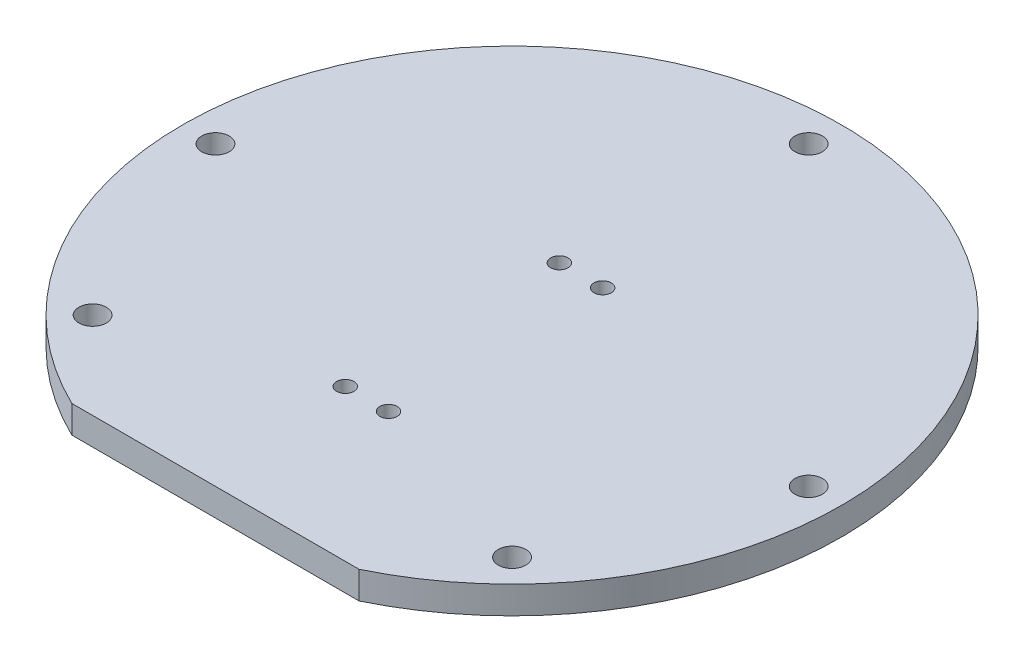
ISO-10303-21;
HEADER;
FILE_DESCRIPTION(('STEP AP214'),'2;1');
FILE_NAME('part.step','',(''),(''),'','','');
FILE_SCHEMA(('AUTOMOTIVE_DESIGN { 1 0 10303 214 1 1 1 1 }'));
ENDSEC;
DATA;
#1=APPLICATION_CONTEXT('core data for automotive mechanical design processes');
#2=APPLICATION_PROTOCOL_DEFINITION('international standard','automotive_design',2000,#1);
#3=PRODUCT_CONTEXT('',#1,'mechanical');
#4=PRODUCT('Part','Part','',(#3));
#5=PRODUCT_RELATED_PRODUCT_CATEGORY('part','',(#4));
#6=PRODUCT_DEFINITION_FORMATION('','',#4);
#7=PRODUCT_DEFINITION_CONTEXT('part definition',#1,'design');
#8=PRODUCT_DEFINITION('design','',#6,#7);
#9=PRODUCT_DEFINITION_SHAPE('','',#8);
#10=(LENGTH_UNIT() NAMED_UNIT(*) SI_UNIT(.MILLI.,.METRE.));
#11=(NAMED_UNIT(*) PLANE_ANGLE_UNIT() SI_UNIT($,.RADIAN.));
#12=(NAMED_UNIT(*) SI_UNIT($,.STERADIAN.) SOLID_ANGLE_UNIT());
#13=UNCERTAINTY_MEASURE_WITH_UNIT(LENGTH_MEASURE(1.E-05),#10,'distance_accuracy_value','');
#14=(GEOMETRIC_REPRESENTATION_CONTEXT(3) GLOBAL_UNCERTAINTY_ASSIGNED_CONTEXT((#13)) GLOBAL_UNIT_ASSIGNED_CONTEXT((#10,
#11,#12)) REPRESENTATION_CONTEXT('',''));
#15=CARTESIAN_POINT('',(0.,0.,0.));
#16=DIRECTION('',(0.,0.,1.));
#17=DIRECTION('',(1.,0.,0.));
#18=AXIS2_PLACEMENT_3D('',#15,#16,#17);
#19=CARTESIAN_POINT('',(0.,6.35,68.58));
#20=DIRECTION('',(0.,0.,1.));
#21=DIRECTION('',(1.,0.,0.));
#22=AXIS2_PLACEMENT_3D('',#19,#20,#21);
#23=PLANE('',#22);
#24=DIRECTION('',(-1.,0.,0.));
#25=VECTOR('',#24,1.);
#26=CARTESIAN_POINT('',(0.,0.,68.58));
#27=LINE('',#26,#25);
#28=CARTESIAN_POINT('',(33.2148099497799,0.,68.58));
#29=VERTEX_POINT('',#28);
#30=CARTESIAN_POINT('',(-33.2148099497799,0.,68.58));
#31=VERTEX_POINT('',#30);
#32=EDGE_CURVE('E77',#29,#31,#27,.T.);
#33=ORIENTED_EDGE('',*,*,#32,.F.);
#34=DIRECTION('',(0.,-1.,0.));
#35=VECTOR('',#34,1.);
#36=CARTESIAN_POINT('',(33.2148099497799,6.35,68.58));
#37=LINE('',#36,#35);
#38=CARTESIAN_POINT('',(33.2148099497799,6.35,68.58));
#39=VERTEX_POINT('',#38);
#40=EDGE_CURVE('E13',#39,#29,#37,.T.);
#41=ORIENTED_EDGE('',*,*,#40,.F.);
#42=DIRECTION('',(-1.,0.,0.));
#43=VECTOR('',#42,1.);
#44=CARTESIAN_POINT('',(0.,6.35,68.58));
#45=LINE('',#44,#43);
#46=CARTESIAN_POINT('',(-33.2148099497799,6.35,68.58));
#47=VERTEX_POINT('',#46);
#48=EDGE_CURVE('E78',#39,#47,#45,.T.);
#49=ORIENTED_EDGE('',*,*,#48,.T.);
#50=DIRECTION('',(0.,-1.,0.));
#51=VECTOR('',#50,1.);
#52=CARTESIAN_POINT('',(-33.2148099497799,6.35,68.58));
#53=LINE('',#52,#51);
#54=EDGE_CURVE('E57',#47,#31,#53,.T.);
#55=ORIENTED_EDGE('',*,*,#54,.T.);
#56=EDGE_LOOP('',(#33,#41,#49,#55));
#57=FACE_BOUND('',#56,.T.);
#58=ADVANCED_FACE('F48',(#57),#23,.T.);
#59=CARTESIAN_POINT('',(-5.0038,6.35,-15.9411453369293));
#60=DIRECTION('',(0.,-1.,0.));
#61=DIRECTION('',(0.,0.,-1.));
#62=AXIS2_PLACEMENT_3D('',#59,#60,#61);
#63=CYLINDRICAL_SURFACE('',#62,2.);
#64=CARTESIAN_POINT('',(-5.0038,6.35,-15.9411453369293));
#65=DIRECTION('',(0.,1.,0.));
#66=DIRECTION('',(0.,0.,1.));
#67=AXIS2_PLACEMENT_3D('',#64,#65,#66);
#68=CIRCLE('',#67,2.);
#69=CARTESIAN_POINT('',(-5.0038,6.35,-13.9411453369293));
#70=VERTEX_POINT('',#69);
#71=EDGE_CURVE('E116',#70,#70,#68,.T.);
#72=ORIENTED_EDGE('',*,*,#71,.T.);
#73=EDGE_LOOP('',(#72));
#74=FACE_BOUND('',#73,.T.);
#75=CARTESIAN_POINT('',(-5.0038,0.,-15.9411453369293));
#76=DIRECTION('',(0.,1.,0.));
#77=DIRECTION('',(0.,0.,1.));
#78=AXIS2_PLACEMENT_3D('',#75,#76,#77);
#79=CIRCLE('',#78,2.);
#80=CARTESIAN_POINT('',(-5.0038,0.,-13.9411453369293));
#81=VERTEX_POINT('',#80);
#82=EDGE_CURVE('E85',#81,#81,#79,.T.);
#83=ORIENTED_EDGE('',*,*,#82,.F.);
#84=EDGE_LOOP('',(#83));
#85=FACE_BOUND('',#84,.T.);
#86=ADVANCED_FACE('F165',(#74,#85),#63,.F.);
#87=CARTESIAN_POINT('',(5.0038,6.35,33.5634546630707));
#88=DIRECTION('',(0.,-1.,0.));
#89=DIRECTION('',(0.,0.,-1.));
#90=AXIS2_PLACEMENT_3D('',#87,#88,#89);
#91=CYLINDRICAL_SURFACE('',#90,2.);
#92=CARTESIAN_POINT('',(5.0038,6.35,33.5634546630707));
#93=DIRECTION('',(0.,1.,0.));
#94=DIRECTION('',(0.,0.,1.));
#95=AXIS2_PLACEMENT_3D('',#92,#93,#94);
#96=CIRCLE('',#95,2.);
#97=CARTESIAN_POINT('',(5.0038,6.35,35.5634546630707));
#98=VERTEX_POINT('',#97);
#99=EDGE_CURVE('E119',#98,#98,#96,.T.);
#100=ORIENTED_EDGE('',*,*,#99,.T.);
#101=EDGE_LOOP('',(#100));
#102=FACE_BOUND('',#101,.T.);
#103=CARTESIAN_POINT('',(5.0038,0.,33.5634546630707));
#104=DIRECTION('',(0.,1.,0.));
#105=DIRECTION('',(0.,0.,1.));
#106=AXIS2_PLACEMENT_3D('',#103,#104,#105);
#107=CIRCLE('',#106,2.);
#108=CARTESIAN_POINT('',(5.0038,0.,35.5634546630707));
#109=VERTEX_POINT('',#108);
#110=EDGE_CURVE('E88',#109,#109,#107,.T.);
#111=ORIENTED_EDGE('',*,*,#110,.F.);
#112=EDGE_LOOP('',(#111));
#113=FACE_BOUND('',#112,.T.);
#114=ADVANCED_FACE('F168',(#102,#113),#91,.F.);
#115=CARTESIAN_POINT('',(5.0038,6.35,-15.9411453369293));
#116=DIRECTION('',(0.,-1.,0.));
#117=DIRECTION('',(0.,0.,-1.));
#118=AXIS2_PLACEMENT_3D('',#115,#116,#117);
#119=CYLINDRICAL_SURFACE('',#118,2.);
#120=CARTESIAN_POINT('',(5.0038,6.35,-15.9411453369293));
#121=DIRECTION('',(0.,1.,0.));
#122=DIRECTION('',(0.,0.,1.));
#123=AXIS2_PLACEMENT_3D('',#120,#121,#122);
#124=CIRCLE('',#123,2.);
#125=CARTESIAN_POINT('',(5.0038,6.35,-13.9411453369293));
#126=VERTEX_POINT('',#125);
#127=EDGE_CURVE('E122',#126,#126,#124,.T.);
#128=ORIENTED_EDGE('',*,*,#127,.T.);
#129=EDGE_LOOP('',(#128));
#130=FACE_BOUND('',#129,.T.);
#131=CARTESIAN_POINT('',(5.0038,0.,-15.9411453369293));
#132=DIRECTION('',(0.,1.,0.));
#133=DIRECTION('',(0.,0.,1.));
#134=AXIS2_PLACEMENT_3D('',#131,#132,#133);
#135=CIRCLE('',#134,2.);
#136=CARTESIAN_POINT('',(5.0038,0.,-13.9411453369293));
#137=VERTEX_POINT('',#136);
#138=EDGE_CURVE('E93',#137,#137,#135,.T.);
#139=ORIENTED_EDGE('',*,*,#138,.F.);
#140=EDGE_LOOP('',(#139));
#141=FACE_BOUND('',#140,.T.);
#142=ADVANCED_FACE('F186',(#130,#141),#119,.F.);
#143=CARTESIAN_POINT('',(-5.0038,6.35,33.5634546630707));
#144=DIRECTION('',(0.,-1.,0.));
#145=DIRECTION('',(0.,0.,-1.));
#146=AXIS2_PLACEMENT_3D('',#143,#144,#145);
#147=CYLINDRICAL_SURFACE('',#146,2.);
#148=CARTESIAN_POINT('',(-5.0038,6.35,33.5634546630707));
#149=DIRECTION('',(0.,1.,0.));
#150=DIRECTION('',(0.,0.,1.));
#151=AXIS2_PLACEMENT_3D('',#148,#149,#150);
#152=CIRCLE('',#151,2.);
#153=CARTESIAN_POINT('',(-5.0038,6.35,35.5634546630707));
#154=VERTEX_POINT('',#153);
#155=EDGE_CURVE('E125',#154,#154,#152,.T.);
#156=ORIENTED_EDGE('',*,*,#155,.T.);
#157=EDGE_LOOP('',(#156));
#158=FACE_BOUND('',#157,.T.);
#159=CARTESIAN_POINT('',(-5.0038,0.,33.5634546630707));
#160=DIRECTION('',(0.,1.,0.));
#161=DIRECTION('',(0.,0.,1.));
#162=AXIS2_PLACEMENT_3D('',#159,#160,#161);
#163=CIRCLE('',#162,2.);
#164=CARTESIAN_POINT('',(-5.0038,0.,35.5634546630707));
#165=VERTEX_POINT('',#164);
#166=EDGE_CURVE('E96',#165,#165,#163,.T.);
#167=ORIENTED_EDGE('',*,*,#166,.F.);
#168=EDGE_LOOP('',(#167));
#169=FACE_BOUND('',#168,.T.);
#170=ADVANCED_FACE('F190',(#158,#169),#147,.F.);
#171=CARTESIAN_POINT('',(-68.58,6.35,0.));
#172=DIRECTION('',(0.,-1.,0.));
#173=DIRECTION('',(0.,0.,-1.));
#174=AXIS2_PLACEMENT_3D('',#171,#172,#173);
#175=CYLINDRICAL_SURFACE('',#174,3.175);
#176=CARTESIAN_POINT('',(-68.58,6.35,0.));
#177=DIRECTION('',(0.,1.,0.));
#178=DIRECTION('',(0.,0.,1.));
#179=AXIS2_PLACEMENT_3D('',#176,#177,#178);
#180=CIRCLE('',#179,3.175);
#181=CARTESIAN_POINT('',(-68.58,6.35,3.175));
#182=VERTEX_POINT('',#181);
#183=EDGE_CURVE('E128',#182,#182,#180,.T.);
#184=ORIENTED_EDGE('',*,*,#183,.T.);
#185=EDGE_LOOP('',(#184));
#186=FACE_BOUND('',#185,.T.);
#187=CARTESIAN_POINT('',(-68.58,0.,0.));
#188=DIRECTION('',(0.,1.,0.));
#189=DIRECTION('',(0.,0.,1.));
#190=AXIS2_PLACEMENT_3D('',#187,#188,#189);
#191=CIRCLE('',#190,3.175);
#192=CARTESIAN_POINT('',(-68.58,0.,3.175));
#193=VERTEX_POINT('',#192);
#194=EDGE_CURVE('E99',#193,#193,#191,.T.);
#195=ORIENTED_EDGE('',*,*,#194,.F.);
#196=EDGE_LOOP('',(#195));
#197=FACE_BOUND('',#196,.T.);
#198=ADVANCED_FACE('F194',(#186,#197),#175,.F.);
#199=CARTESIAN_POINT('',(68.58,6.35,0.));
#200=DIRECTION('',(0.,-1.,0.));
#201=DIRECTION('',(0.,0.,-1.));
#202=AXIS2_PLACEMENT_3D('',#199,#200,#201);
#203=CYLINDRICAL_SURFACE('',#202,3.175);
#204=CARTESIAN_POINT('',(68.58,6.35,0.));
#205=DIRECTION('',(0.,1.,0.));
#206=DIRECTION('',(0.,0.,1.));
#207=AXIS2_PLACEMENT_3D('',#204,#205,#206);
#208=CIRCLE('',#207,3.175);
#209=CARTESIAN_POINT('',(68.58,6.35,3.175));
#210=VERTEX_POINT('',#209);
#211=EDGE_CURVE('E131',#210,#210,#208,.T.);
#212=ORIENTED_EDGE('',*,*,#211,.T.);
#213=EDGE_LOOP('',(#212));
#214=FACE_BOUND('',#213,.T.);
#215=CARTESIAN_POINT('',(68.58,0.,0.));
#216=DIRECTION('',(0.,1.,0.));
#217=DIRECTION('',(0.,0.,1.));
#218=AXIS2_PLACEMENT_3D('',#215,#216,#217);
#219=CIRCLE('',#218,3.175);
#220=CARTESIAN_POINT('',(68.58,0.,3.175));
#221=VERTEX_POINT('',#220);
#222=EDGE_CURVE('E102',#221,#221,#219,.T.);
#223=ORIENTED_EDGE('',*,*,#222,.F.);
#224=EDGE_LOOP('',(#223));
#225=FACE_BOUND('',#224,.T.);
#226=ADVANCED_FACE('F198',(#214,#225),#203,.F.);
#227=CARTESIAN_POINT('',(0.,6.35,-68.58));
#228=DIRECTION('',(0.,-1.,0.));
#229=DIRECTION('',(0.,0.,-1.));
#230=AXIS2_PLACEMENT_3D('',#227,#228,#229);
#231=CYLINDRICAL_SURFACE('',#230,3.175);
#232=CARTESIAN_POINT('',(0.,6.35,-68.58));
#233=DIRECTION('',(0.,1.,0.));
#234=DIRECTION('',(0.,0.,1.));
#235=AXIS2_PLACEMENT_3D('',#232,#233,#234);
#236=CIRCLE('',#235,3.175);
#237=CARTESIAN_POINT('',(0.,6.35,-65.405));
#238=VERTEX_POINT('',#237);
#239=EDGE_CURVE('E134',#238,#238,#236,.T.);
#240=ORIENTED_EDGE('',*,*,#239,.T.);
#241=EDGE_LOOP('',(#240));
#242=FACE_BOUND('',#241,.T.);
#243=CARTESIAN_POINT('',(0.,0.,-68.58));
#244=DIRECTION('',(0.,1.,0.));
#245=DIRECTION('',(0.,0.,1.));
#246=AXIS2_PLACEMENT_3D('',#243,#244,#245);
#247=CIRCLE('',#246,3.175);
#248=CARTESIAN_POINT('',(0.,0.,-65.405));
#249=VERTEX_POINT('',#248);
#250=EDGE_CURVE('E105',#249,#249,#247,.T.);
#251=ORIENTED_EDGE('',*,*,#250,.F.);
#252=EDGE_LOOP('',(#251));
#253=FACE_BOUND('',#252,.T.);
#254=ADVANCED_FACE('F202',(#242,#253),#231,.F.);
#255=CARTESIAN_POINT('',(-48.4933830537733,6.35,48.4933830537735));
#256=DIRECTION('',(0.,-1.,0.));
#257=DIRECTION('',(0.,0.,-1.));
#258=AXIS2_PLACEMENT_3D('',#255,#256,#257);
#259=CYLINDRICAL_SURFACE('',#258,3.175);
#260=CARTESIAN_POINT('',(-48.4933830537733,6.35,48.4933830537735));
#261=DIRECTION('',(0.,1.,0.));
#262=DIRECTION('',(0.,0.,1.));
#263=AXIS2_PLACEMENT_3D('',#260,#261,#262);
#264=CIRCLE('',#263,3.175);
#265=CARTESIAN_POINT('',(-48.4933830537733,6.35,51.6683830537735));
#266=VERTEX_POINT('',#265);
#267=EDGE_CURVE('E137',#266,#266,#264,.T.);
#268=ORIENTED_EDGE('',*,*,#267,.T.);
#269=EDGE_LOOP('',(#268));
#270=FACE_BOUND('',#269,.T.);
#271=CARTESIAN_POINT('',(-48.4933830537733,0.,48.4933830537735));
#272=DIRECTION('',(0.,1.,0.));
#273=DIRECTION('',(0.,0.,1.));
#274=AXIS2_PLACEMENT_3D('',#271,#272,#273);
#275=CIRCLE('',#274,3.175);
#276=CARTESIAN_POINT('',(-48.4933830537733,0.,51.6683830537735));
#277=VERTEX_POINT('',#276);
#278=EDGE_CURVE('E108',#277,#277,#275,.T.);
#279=ORIENTED_EDGE('',*,*,#278,.F.);
#280=EDGE_LOOP('',(#279));
#281=FACE_BOUND('',#280,.T.);
#282=ADVANCED_FACE('F205',(#270,#281),#259,.F.);
#283=CARTESIAN_POINT('',(48.4933830537733,6.35,48.4933830537735));
#284=DIRECTION('',(0.,-1.,0.));
#285=DIRECTION('',(0.,0.,-1.));
#286=AXIS2_PLACEMENT_3D('',#283,#284,#285);
#287=CYLINDRICAL_SURFACE('',#286,3.175);
#288=CARTESIAN_POINT('',(48.4933830537733,6.35,48.4933830537735));
#289=DIRECTION('',(0.,1.,0.));
#290=DIRECTION('',(0.,0.,1.));
#291=AXIS2_PLACEMENT_3D('',#288,#289,#290);
#292=CIRCLE('',#291,3.175);
#293=CARTESIAN_POINT('',(48.4933830537733,6.35,51.6683830537735));
#294=VERTEX_POINT('',#293);
#295=EDGE_CURVE('E82',#294,#294,#292,.T.);
#296=ORIENTED_EDGE('',*,*,#295,.T.);
#297=EDGE_LOOP('',(#296));
#298=FACE_BOUND('',#297,.T.);
#299=CARTESIAN_POINT('',(48.4933830537733,0.,48.4933830537735));
#300=DIRECTION('',(0.,1.,0.));
#301=DIRECTION('',(0.,0.,1.));
#302=AXIS2_PLACEMENT_3D('',#299,#300,#301);
#303=CIRCLE('',#302,3.175);
#304=CARTESIAN_POINT('',(48.4933830537733,0.,51.6683830537735));
#305=VERTEX_POINT('',#304);
#306=EDGE_CURVE('E111',#305,#305,#303,.T.);
#307=ORIENTED_EDGE('',*,*,#306,.F.);
#308=EDGE_LOOP('',(#307));
#309=FACE_BOUND('',#308,.T.);
#310=ADVANCED_FACE('F50',(#298,#309),#287,.F.);
#311=CARTESIAN_POINT('',(0.,6.35,0.));
#312=DIRECTION('',(0.,-1.,0.));
#313=DIRECTION('',(0.,0.,-1.));
#314=AXIS2_PLACEMENT_3D('',#311,#312,#313);
#315=CYLINDRICAL_SURFACE('',#314,76.2);
#316=CARTESIAN_POINT('',(0.,0.,0.));
#317=DIRECTION('',(0.,1.,0.));
#318=DIRECTION('',(0.,0.,1.));
#319=AXIS2_PLACEMENT_3D('',#316,#317,#318);
#320=CIRCLE('',#319,76.2);
#321=EDGE_CURVE('E79',#29,#31,#320,.T.);
#322=ORIENTED_EDGE('',*,*,#321,.T.);
#323=ORIENTED_EDGE('',*,*,#54,.F.);
#324=CARTESIAN_POINT('',(0.,6.35,0.));
#325=DIRECTION('',(0.,1.,0.));
#326=DIRECTION('',(0.,0.,1.));
#327=AXIS2_PLACEMENT_3D('',#324,#325,#326);
#328=CIRCLE('',#327,76.2);
#329=EDGE_CURVE('E64',#39,#47,#328,.T.);
#330=ORIENTED_EDGE('',*,*,#329,.F.);
#331=ORIENTED_EDGE('',*,*,#40,.T.);
#332=EDGE_LOOP('',(#322,#323,#330,#331));
#333=FACE_BOUND('',#332,.T.);
#334=ADVANCED_FACE('F80',(#333),#315,.T.);
#335=CARTESIAN_POINT('',(0.,6.35,0.));
#336=DIRECTION('',(0.,1.,0.));
#337=DIRECTION('',(0.,0.,1.));
#338=AXIS2_PLACEMENT_3D('',#335,#336,#337);
#339=PLANE('',#338);
#340=ORIENTED_EDGE('',*,*,#295,.F.);
#341=EDGE_LOOP('',(#340));
#342=FACE_BOUND('',#341,.T.);
#343=ORIENTED_EDGE('',*,*,#267,.F.);
#344=EDGE_LOOP('',(#343));
#345=FACE_BOUND('',#344,.T.);
#346=ORIENTED_EDGE('',*,*,#239,.F.);
#347=EDGE_LOOP('',(#346));
#348=FACE_BOUND('',#347,.T.);
#349=ORIENTED_EDGE('',*,*,#211,.F.);
#350=EDGE_LOOP('',(#349));
#351=FACE_BOUND('',#350,.T.);
#352=ORIENTED_EDGE('',*,*,#183,.F.);
#353=EDGE_LOOP('',(#352));
#354=FACE_BOUND('',#353,.T.);
#355=ORIENTED_EDGE('',*,*,#155,.F.);
#356=EDGE_LOOP('',(#355));
#357=FACE_BOUND('',#356,.T.);
#358=ORIENTED_EDGE('',*,*,#127,.F.);
#359=EDGE_LOOP('',(#358));
#360=FACE_BOUND('',#359,.T.);
#361=ORIENTED_EDGE('',*,*,#99,.F.);
#362=EDGE_LOOP('',(#361));
#363=FACE_BOUND('',#362,.T.);
#364=ORIENTED_EDGE('',*,*,#71,.F.);
#365=EDGE_LOOP('',(#364));
#366=FACE_BOUND('',#365,.T.);
#367=ORIENTED_EDGE('',*,*,#48,.F.);
#368=ORIENTED_EDGE('',*,*,#329,.T.);
#369=EDGE_LOOP('',(#367,#368));
#370=FACE_BOUND('',#369,.T.);
#371=ADVANCED_FACE('F145',(#342,#345,#348,#351,#354,#357,#360,#363,#366,#370),#339,.T.);
#372=CARTESIAN_POINT('',(0.,0.,0.));
#373=DIRECTION('',(0.,1.,0.));
#374=DIRECTION('',(0.,0.,1.));
#375=AXIS2_PLACEMENT_3D('',#372,#373,#374);
#376=PLANE('',#375);
#377=ORIENTED_EDGE('',*,*,#306,.T.);
#378=EDGE_LOOP('',(#377));
#379=FACE_BOUND('',#378,.T.);
#380=ORIENTED_EDGE('',*,*,#278,.T.);
#381=EDGE_LOOP('',(#380));
#382=FACE_BOUND('',#381,.T.);
#383=ORIENTED_EDGE('',*,*,#250,.T.);
#384=EDGE_LOOP('',(#383));
#385=FACE_BOUND('',#384,.T.);
#386=ORIENTED_EDGE('',*,*,#222,.T.);
#387=EDGE_LOOP('',(#386));
#388=FACE_BOUND('',#387,.T.);
#389=ORIENTED_EDGE('',*,*,#194,.T.);
#390=EDGE_LOOP('',(#389));
#391=FACE_BOUND('',#390,.T.);
#392=ORIENTED_EDGE('',*,*,#166,.T.);
#393=EDGE_LOOP('',(#392));
#394=FACE_BOUND('',#393,.T.);
#395=ORIENTED_EDGE('',*,*,#138,.T.);
#396=EDGE_LOOP('',(#395));
#397=FACE_BOUND('',#396,.T.);
#398=ORIENTED_EDGE('',*,*,#110,.T.);
#399=EDGE_LOOP('',(#398));
#400=FACE_BOUND('',#399,.T.);
#401=ORIENTED_EDGE('',*,*,#82,.T.);
#402=EDGE_LOOP('',(#401));
#403=FACE_BOUND('',#402,.T.);
#404=ORIENTED_EDGE('',*,*,#32,.T.);
#405=ORIENTED_EDGE('',*,*,#321,.F.);
#406=EDGE_LOOP('',(#404,#405));
#407=FACE_BOUND('',#406,.T.);
#408=ADVANCED_FACE('F84',(#379,#382,#385,#388,#391,#394,#397,#400,#403,#407),#376,.F.);
#409=CLOSED_SHELL('',(#58,#86,#114,#142,#170,#198,#226,#254,#282,#310,#334,#371,#408));
#410=MANIFOLD_SOLID_BREP('B2',#409);
#411=ADVANCED_BREP_SHAPE_REPRESENTATION('',(#18,#410),#14);
#412=SHAPE_DEFINITION_REPRESENTATION(#9,#411);
ENDSEC;
END-ISO-10303-21;
